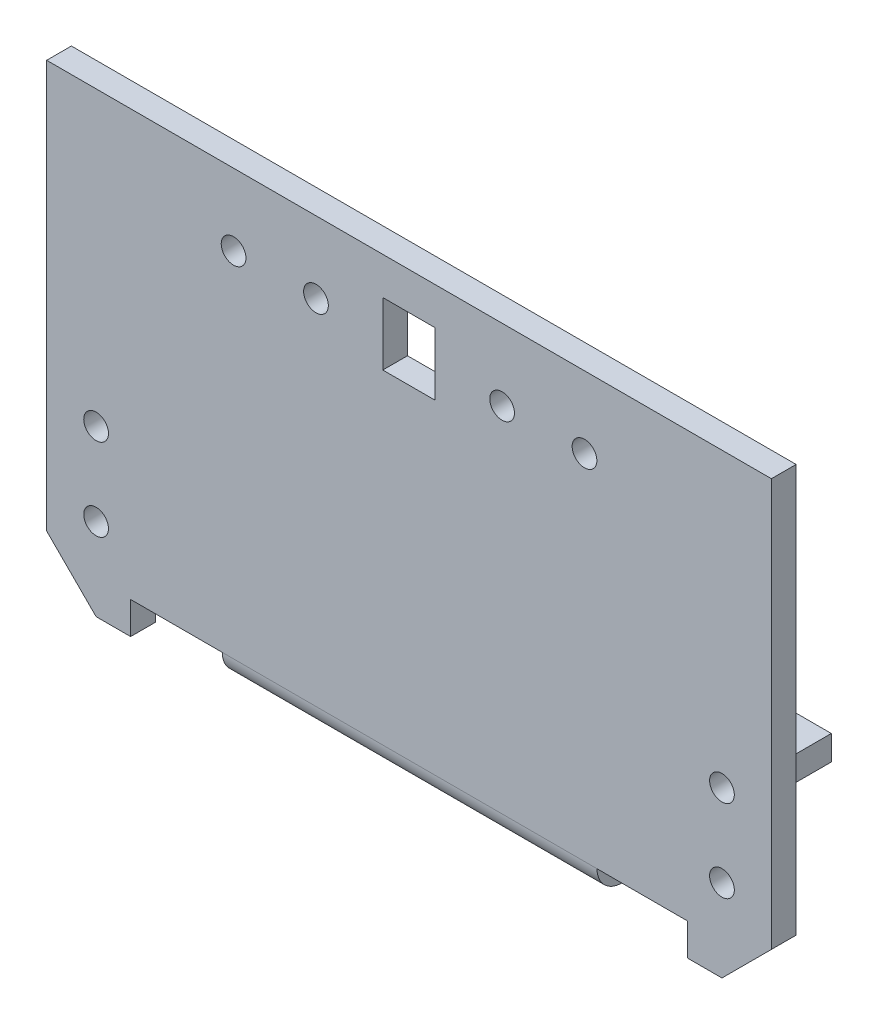
ISO-10303-21;
HEADER;
FILE_DESCRIPTION(('STEP AP214'),'2;1');
FILE_NAME('part.step','',(''),(''),'','','');
FILE_SCHEMA(('AUTOMOTIVE_DESIGN { 1 0 10303 214 1 1 1 1 }'));
ENDSEC;
DATA;
#1=APPLICATION_CONTEXT('core data for automotive mechanical design processes');
#2=APPLICATION_PROTOCOL_DEFINITION('international standard','automotive_design',2000,#1);
#3=PRODUCT_CONTEXT('',#1,'mechanical');
#4=PRODUCT('Part','Part','',(#3));
#5=PRODUCT_RELATED_PRODUCT_CATEGORY('part','',(#4));
#6=PRODUCT_DEFINITION_FORMATION('','',#4);
#7=PRODUCT_DEFINITION_CONTEXT('part definition',#1,'design');
#8=PRODUCT_DEFINITION('design','',#6,#7);
#9=PRODUCT_DEFINITION_SHAPE('','',#8);
#10=(LENGTH_UNIT() NAMED_UNIT(*) SI_UNIT(.MILLI.,.METRE.));
#11=(NAMED_UNIT(*) PLANE_ANGLE_UNIT() SI_UNIT($,.RADIAN.));
#12=(NAMED_UNIT(*) SI_UNIT($,.STERADIAN.) SOLID_ANGLE_UNIT());
#13=UNCERTAINTY_MEASURE_WITH_UNIT(LENGTH_MEASURE(1.E-05),#10,'distance_accuracy_value','');
#14=(GEOMETRIC_REPRESENTATION_CONTEXT(3) GLOBAL_UNCERTAINTY_ASSIGNED_CONTEXT((#13)) GLOBAL_UNIT_ASSIGNED_CONTEXT((#10,
#11,#12)) REPRESENTATION_CONTEXT('',''));
#15=CARTESIAN_POINT('',(0.,0.,0.));
#16=DIRECTION('',(0.,0.,1.));
#17=DIRECTION('',(1.,0.,0.));
#18=AXIS2_PLACEMENT_3D('',#15,#16,#17);
#19=CARTESIAN_POINT('',(33.7878643475448,18.60245734683,3.));
#20=DIRECTION('',(0.,-1.,0.));
#21=DIRECTION('',(1.,0.,0.));
#22=AXIS2_PLACEMENT_3D('',#19,#20,#21);
#23=PLANE('',#22);
#24=DIRECTION('',(-1.,0.,0.));
#25=VECTOR('',#24,1.);
#26=CARTESIAN_POINT('',(33.7878643475448,18.60245734683,0.));
#27=LINE('',#26,#25);
#28=CARTESIAN_POINT('',(-22.6647167125975,18.60245734683,0.));
#29=VERTEX_POINT('',#28);
#30=CARTESIAN_POINT('',(-33.7878643475448,18.60245734683,0.));
#31=VERTEX_POINT('',#30);
#32=EDGE_CURVE('E447',#29,#31,#27,.T.);
#33=ORIENTED_EDGE('',*,*,#32,.F.);
#34=DIRECTION('',(0.,0.,-1.));
#35=VECTOR('',#34,1.);
#36=CARTESIAN_POINT('',(-22.6647167125975,18.60245734683,0.));
#37=LINE('',#36,#35);
#38=CARTESIAN_POINT('',(-22.6647167125975,18.60245734683,3.));
#39=VERTEX_POINT('',#38);
#40=EDGE_CURVE('E234',#39,#29,#37,.T.);
#41=ORIENTED_EDGE('',*,*,#40,.F.);
#42=DIRECTION('',(-1.,0.,0.));
#43=VECTOR('',#42,1.);
#44=CARTESIAN_POINT('',(33.7878643475448,18.60245734683,3.));
#45=LINE('',#44,#43);
#46=CARTESIAN_POINT('',(-33.7878643475448,18.60245734683,3.));
#47=VERTEX_POINT('',#46);
#48=EDGE_CURVE('E411',#39,#47,#45,.T.);
#49=ORIENTED_EDGE('',*,*,#48,.T.);
#50=DIRECTION('',(0.,0.,-1.));
#51=VECTOR('',#50,1.);
#52=CARTESIAN_POINT('',(-33.7878643475448,18.60245734683,3.));
#53=LINE('',#52,#51);
#54=EDGE_CURVE('E482',#47,#31,#53,.T.);
#55=ORIENTED_EDGE('',*,*,#54,.T.);
#56=EDGE_LOOP('',(#33,#41,#49,#55));
#57=FACE_BOUND('',#56,.T.);
#58=ADVANCED_FACE('F47',(#57),#23,.T.);
#59=CARTESIAN_POINT('',(-43.9759450395278,70.1751243029359,3.));
#60=DIRECTION('',(0.,1.,0.));
#61=DIRECTION('',(0.,0.,1.));
#62=AXIS2_PLACEMENT_3D('',#59,#60,#61);
#63=PLANE('',#62);
#64=DIRECTION('',(1.,0.,0.));
#65=VECTOR('',#64,1.);
#66=CARTESIAN_POINT('',(-43.9759450395278,70.1751243029359,0.));
#67=LINE('',#66,#65);
#68=CARTESIAN_POINT('',(-43.9759450395278,70.1751243029359,0.));
#69=VERTEX_POINT('',#68);
#70=CARTESIAN_POINT('',(43.9759450395278,70.1751243029359,0.));
#71=VERTEX_POINT('',#70);
#72=EDGE_CURVE('E392',#69,#71,#67,.T.);
#73=ORIENTED_EDGE('',*,*,#72,.F.);
#74=DIRECTION('',(0.,0.,-1.));
#75=VECTOR('',#74,1.);
#76=CARTESIAN_POINT('',(-43.9759450395278,70.1751243029359,3.));
#77=LINE('',#76,#75);
#78=CARTESIAN_POINT('',(-43.9759450395278,70.1751243029359,3.));
#79=VERTEX_POINT('',#78);
#80=EDGE_CURVE('E468',#79,#69,#77,.T.);
#81=ORIENTED_EDGE('',*,*,#80,.F.);
#82=DIRECTION('',(1.,0.,0.));
#83=VECTOR('',#82,1.);
#84=CARTESIAN_POINT('',(-43.9759450395278,70.1751243029359,3.));
#85=LINE('',#84,#83);
#86=CARTESIAN_POINT('',(43.9759450395278,70.1751243029359,3.));
#87=VERTEX_POINT('',#86);
#88=EDGE_CURVE('E393',#79,#87,#85,.T.);
#89=ORIENTED_EDGE('',*,*,#88,.T.);
#90=DIRECTION('',(0.,0.,-1.));
#91=VECTOR('',#90,1.);
#92=CARTESIAN_POINT('',(43.9759450395278,70.1751243029359,3.));
#93=LINE('',#92,#91);
#94=EDGE_CURVE('E431',#87,#71,#93,.T.);
#95=ORIENTED_EDGE('',*,*,#94,.T.);
#96=EDGE_LOOP('',(#73,#81,#89,#95));
#97=FACE_BOUND('',#96,.T.);
#98=ADVANCED_FACE('F568',(#97),#63,.T.);
#99=CARTESIAN_POINT('',(-43.9759450395278,28.4551243029359,3.));
#100=DIRECTION('',(-1.,0.,0.));
#101=DIRECTION('',(0.,0.,1.));
#102=AXIS2_PLACEMENT_3D('',#99,#100,#101);
#103=PLANE('',#102);
#104=DIRECTION('',(0.,1.,0.));
#105=VECTOR('',#104,1.);
#106=CARTESIAN_POINT('',(-43.9759450395278,28.4551243029359,0.));
#107=LINE('',#106,#105);
#108=CARTESIAN_POINT('',(-43.9759450395278,20.6992622489842,0.));
#109=VERTEX_POINT('',#108);
#110=EDGE_CURVE('E398',#109,#69,#107,.T.);
#111=ORIENTED_EDGE('',*,*,#110,.F.);
#112=DIRECTION('',(0.,0.,-1.));
#113=VECTOR('',#112,1.);
#114=CARTESIAN_POINT('',(-43.9759450395278,20.6992622489842,3.));
#115=LINE('',#114,#113);
#116=CARTESIAN_POINT('',(-43.9759450395278,20.6992622489842,3.));
#117=VERTEX_POINT('',#116);
#118=EDGE_CURVE('E472',#117,#109,#115,.T.);
#119=ORIENTED_EDGE('',*,*,#118,.F.);
#120=DIRECTION('',(0.,1.,0.));
#121=VECTOR('',#120,1.);
#122=CARTESIAN_POINT('',(-43.9759450395278,20.6992622489842,3.));
#123=LINE('',#122,#121);
#124=EDGE_CURVE('E428',#117,#79,#123,.T.);
#125=ORIENTED_EDGE('',*,*,#124,.T.);
#126=ORIENTED_EDGE('',*,*,#80,.T.);
#127=EDGE_LOOP('',(#111,#119,#125,#126));
#128=FACE_BOUND('',#127,.T.);
#129=ADVANCED_FACE('F562',(#128),#103,.T.);
#130=CARTESIAN_POINT('',(-37.9759450395278,14.6992622489842,3.));
#131=DIRECTION('',(-0.707106781186548,-0.707106781186548,0.));
#132=DIRECTION('',(0.707106781186548,-0.707106781186548,0.));
#133=AXIS2_PLACEMENT_3D('',#130,#131,#132);
#134=PLANE('',#133);
#135=DIRECTION('',(-0.707106781186547,0.707106781186547,0.));
#136=VECTOR('',#135,1.);
#137=CARTESIAN_POINT('',(-37.9759450395278,14.6992622489842,0.));
#138=LINE('',#137,#136);
#139=CARTESIAN_POINT('',(-37.9759450395278,14.6992622489842,0.));
#140=VERTEX_POINT('',#139);
#141=EDGE_CURVE('E461',#140,#109,#138,.T.);
#142=ORIENTED_EDGE('',*,*,#141,.F.);
#143=DIRECTION('',(0.,0.,-1.));
#144=VECTOR('',#143,1.);
#145=CARTESIAN_POINT('',(-37.9759450395278,14.6992622489842,3.));
#146=LINE('',#145,#144);
#147=CARTESIAN_POINT('',(-37.9759450395278,14.6992622489842,3.));
#148=VERTEX_POINT('',#147);
#149=EDGE_CURVE('E476',#148,#140,#146,.T.);
#150=ORIENTED_EDGE('',*,*,#149,.F.);
#151=DIRECTION('',(-0.707106781186547,0.707106781186547,0.));
#152=VECTOR('',#151,1.);
#153=CARTESIAN_POINT('',(-37.9759450395278,14.6992622489842,3.));
#154=LINE('',#153,#152);
#155=EDGE_CURVE('E424',#148,#117,#154,.T.);
#156=ORIENTED_EDGE('',*,*,#155,.T.);
#157=ORIENTED_EDGE('',*,*,#118,.T.);
#158=EDGE_LOOP('',(#142,#150,#156,#157));
#159=FACE_BOUND('',#158,.T.);
#160=ADVANCED_FACE('F558',(#159),#134,.T.);
#161=CARTESIAN_POINT('',(-33.7878643475448,14.6992622489842,3.));
#162=DIRECTION('',(0.,-1.,0.));
#163=DIRECTION('',(0.,0.,-1.));
#164=AXIS2_PLACEMENT_3D('',#161,#162,#163);
#165=PLANE('',#164);
#166=DIRECTION('',(-1.,0.,0.));
#167=VECTOR('',#166,1.);
#168=CARTESIAN_POINT('',(-33.7878643475448,14.6992622489842,0.));
#169=LINE('',#168,#167);
#170=CARTESIAN_POINT('',(-33.7878643475448,14.6992622489842,0.));
#171=VERTEX_POINT('',#170);
#172=EDGE_CURVE('E457',#171,#140,#169,.T.);
#173=ORIENTED_EDGE('',*,*,#172,.F.);
#174=DIRECTION('',(0.,0.,-1.));
#175=VECTOR('',#174,1.);
#176=CARTESIAN_POINT('',(-33.7878643475448,14.6992622489842,3.));
#177=LINE('',#176,#175);
#178=CARTESIAN_POINT('',(-33.7878643475448,14.6992622489842,3.));
#179=VERTEX_POINT('',#178);
#180=EDGE_CURVE('E479',#179,#171,#177,.T.);
#181=ORIENTED_EDGE('',*,*,#180,.F.);
#182=DIRECTION('',(-1.,0.,0.));
#183=VECTOR('',#182,1.);
#184=CARTESIAN_POINT('',(-33.7878643475448,14.6992622489842,3.));
#185=LINE('',#184,#183);
#186=EDGE_CURVE('E420',#179,#148,#185,.T.);
#187=ORIENTED_EDGE('',*,*,#186,.T.);
#188=ORIENTED_EDGE('',*,*,#149,.T.);
#189=EDGE_LOOP('',(#173,#181,#187,#188));
#190=FACE_BOUND('',#189,.T.);
#191=ADVANCED_FACE('F555',(#190),#165,.T.);
#192=CARTESIAN_POINT('',(-33.7878643475448,18.60245734683,3.));
#193=DIRECTION('',(1.,0.,0.));
#194=DIRECTION('',(0.,0.,-1.));
#195=AXIS2_PLACEMENT_3D('',#192,#193,#194);
#196=PLANE('',#195);
#197=DIRECTION('',(0.,-1.,0.));
#198=VECTOR('',#197,1.);
#199=CARTESIAN_POINT('',(-33.7878643475448,18.60245734683,0.));
#200=LINE('',#199,#198);
#201=EDGE_CURVE('E452',#31,#171,#200,.T.);
#202=ORIENTED_EDGE('',*,*,#201,.F.);
#203=ORIENTED_EDGE('',*,*,#54,.F.);
#204=DIRECTION('',(0.,-1.,0.));
#205=VECTOR('',#204,1.);
#206=CARTESIAN_POINT('',(-33.7878643475448,18.60245734683,3.));
#207=LINE('',#206,#205);
#208=EDGE_CURVE('E416',#47,#179,#207,.T.);
#209=ORIENTED_EDGE('',*,*,#208,.T.);
#210=ORIENTED_EDGE('',*,*,#180,.T.);
#211=EDGE_LOOP('',(#202,#203,#209,#210));
#212=FACE_BOUND('',#211,.T.);
#213=ADVANCED_FACE('F551',(#212),#196,.T.);
#214=DIRECTION('',(0.,0.,-1.));
#215=VECTOR('',#214,1.);
#216=CARTESIAN_POINT('',(22.8152832874025,18.60245734683,0.));
#217=LINE('',#216,#215);
#218=CARTESIAN_POINT('',(22.8152832874025,18.60245734683,3.));
#219=VERTEX_POINT('',#218);
#220=CARTESIAN_POINT('',(22.8152832874025,18.60245734683,0.));
#221=VERTEX_POINT('',#220);
#222=EDGE_CURVE('E265',#219,#221,#217,.T.);
#223=ORIENTED_EDGE('',*,*,#222,.T.);
#224=CARTESIAN_POINT('',(33.7878643475448,18.60245734683,0.));
#225=VERTEX_POINT('',#224);
#226=EDGE_CURVE('E448',#225,#221,#27,.T.);
#227=ORIENTED_EDGE('',*,*,#226,.F.);
#228=DIRECTION('',(0.,0.,-1.));
#229=VECTOR('',#228,1.);
#230=CARTESIAN_POINT('',(33.7878643475448,18.60245734683,3.));
#231=LINE('',#230,#229);
#232=CARTESIAN_POINT('',(33.7878643475448,18.60245734683,3.));
#233=VERTEX_POINT('',#232);
#234=EDGE_CURVE('E486',#233,#225,#231,.T.);
#235=ORIENTED_EDGE('',*,*,#234,.F.);
#236=EDGE_CURVE('E412',#233,#219,#45,.T.);
#237=ORIENTED_EDGE('',*,*,#236,.T.);
#238=EDGE_LOOP('',(#223,#227,#235,#237));
#239=FACE_BOUND('',#238,.T.);
#240=ADVANCED_FACE('F517',(#239),#23,.T.);
#241=CARTESIAN_POINT('',(33.7878643475448,18.60245734683,3.));
#242=DIRECTION('',(1.,0.,0.));
#243=DIRECTION('',(0.,0.,-1.));
#244=AXIS2_PLACEMENT_3D('',#241,#242,#243);
#245=PLANE('',#244);
#246=DIRECTION('',(0.,-1.,0.));
#247=VECTOR('',#246,1.);
#248=CARTESIAN_POINT('',(33.7878643475448,18.60245734683,0.));
#249=LINE('',#248,#247);
#250=CARTESIAN_POINT('',(33.7878643475448,14.6992622489842,0.));
#251=VERTEX_POINT('',#250);
#252=EDGE_CURVE('E444',#225,#251,#249,.T.);
#253=ORIENTED_EDGE('',*,*,#252,.T.);
#254=DIRECTION('',(0.,0.,-1.));
#255=VECTOR('',#254,1.);
#256=CARTESIAN_POINT('',(33.7878643475448,14.6992622489842,3.));
#257=LINE('',#256,#255);
#258=CARTESIAN_POINT('',(33.7878643475448,14.6992622489842,3.));
#259=VERTEX_POINT('',#258);
#260=EDGE_CURVE('E489',#259,#251,#257,.T.);
#261=ORIENTED_EDGE('',*,*,#260,.F.);
#262=DIRECTION('',(0.,-1.,0.));
#263=VECTOR('',#262,1.);
#264=CARTESIAN_POINT('',(33.7878643475448,18.60245734683,3.));
#265=LINE('',#264,#263);
#266=EDGE_CURVE('E408',#233,#259,#265,.T.);
#267=ORIENTED_EDGE('',*,*,#266,.F.);
#268=ORIENTED_EDGE('',*,*,#234,.T.);
#269=EDGE_LOOP('',(#253,#261,#267,#268));
#270=FACE_BOUND('',#269,.T.);
#271=ADVANCED_FACE('F585',(#270),#245,.F.);
#272=CARTESIAN_POINT('',(33.7878643475448,14.6992622489842,3.));
#273=DIRECTION('',(0.,1.,0.));
#274=DIRECTION('',(0.,0.,1.));
#275=AXIS2_PLACEMENT_3D('',#272,#273,#274);
#276=PLANE('',#275);
#277=DIRECTION('',(1.,0.,0.));
#278=VECTOR('',#277,1.);
#279=CARTESIAN_POINT('',(33.7878643475448,14.6992622489842,0.));
#280=LINE('',#279,#278);
#281=CARTESIAN_POINT('',(37.9759450395278,14.6992622489842,0.));
#282=VERTEX_POINT('',#281);
#283=EDGE_CURVE('E441',#251,#282,#280,.T.);
#284=ORIENTED_EDGE('',*,*,#283,.T.);
#285=DIRECTION('',(0.,0.,-1.));
#286=VECTOR('',#285,1.);
#287=CARTESIAN_POINT('',(37.9759450395278,14.6992622489842,3.));
#288=LINE('',#287,#286);
#289=CARTESIAN_POINT('',(37.9759450395278,14.6992622489842,3.));
#290=VERTEX_POINT('',#289);
#291=EDGE_CURVE('E493',#290,#282,#288,.T.);
#292=ORIENTED_EDGE('',*,*,#291,.F.);
#293=DIRECTION('',(1.,0.,0.));
#294=VECTOR('',#293,1.);
#295=CARTESIAN_POINT('',(33.7878643475448,14.6992622489842,3.));
#296=LINE('',#295,#294);
#297=EDGE_CURVE('E405',#259,#290,#296,.T.);
#298=ORIENTED_EDGE('',*,*,#297,.F.);
#299=ORIENTED_EDGE('',*,*,#260,.T.);
#300=EDGE_LOOP('',(#284,#292,#298,#299));
#301=FACE_BOUND('',#300,.T.);
#302=ADVANCED_FACE('F581',(#301),#276,.F.);
#303=CARTESIAN_POINT('',(37.9759450395278,14.6992622489842,3.));
#304=DIRECTION('',(-0.707106781186548,0.707106781186548,0.));
#305=DIRECTION('',(-0.707106781186548,-0.707106781186548,0.));
#306=AXIS2_PLACEMENT_3D('',#303,#304,#305);
#307=PLANE('',#306);
#308=DIRECTION('',(0.707106781186547,0.707106781186547,0.));
#309=VECTOR('',#308,1.);
#310=CARTESIAN_POINT('',(37.9759450395278,14.6992622489842,0.));
#311=LINE('',#310,#309);
#312=CARTESIAN_POINT('',(43.9759450395278,20.6992622489842,0.));
#313=VERTEX_POINT('',#312);
#314=EDGE_CURVE('E438',#282,#313,#311,.T.);
#315=ORIENTED_EDGE('',*,*,#314,.T.);
#316=DIRECTION('',(0.,0.,-1.));
#317=VECTOR('',#316,1.);
#318=CARTESIAN_POINT('',(43.9759450395278,20.6992622489842,3.));
#319=LINE('',#318,#317);
#320=CARTESIAN_POINT('',(43.9759450395278,20.6992622489842,3.));
#321=VERTEX_POINT('',#320);
#322=EDGE_CURVE('E497',#321,#313,#319,.T.);
#323=ORIENTED_EDGE('',*,*,#322,.F.);
#324=DIRECTION('',(0.707106781186547,0.707106781186547,0.));
#325=VECTOR('',#324,1.);
#326=CARTESIAN_POINT('',(37.9759450395278,14.6992622489842,3.));
#327=LINE('',#326,#325);
#328=EDGE_CURVE('E401',#290,#321,#327,.T.);
#329=ORIENTED_EDGE('',*,*,#328,.F.);
#330=ORIENTED_EDGE('',*,*,#291,.T.);
#331=EDGE_LOOP('',(#315,#323,#329,#330));
#332=FACE_BOUND('',#331,.T.);
#333=ADVANCED_FACE('F577',(#332),#307,.F.);
#334=CARTESIAN_POINT('',(43.9759450395278,20.6992622489842,3.));
#335=DIRECTION('',(-1.,0.,0.));
#336=DIRECTION('',(0.,0.,1.));
#337=AXIS2_PLACEMENT_3D('',#334,#335,#336);
#338=PLANE('',#337);
#339=DIRECTION('',(0.,1.,0.));
#340=VECTOR('',#339,1.);
#341=CARTESIAN_POINT('',(43.9759450395278,20.6992622489842,0.));
#342=LINE('',#341,#340);
#343=EDGE_CURVE('E435',#313,#71,#342,.T.);
#344=ORIENTED_EDGE('',*,*,#343,.T.);
#345=ORIENTED_EDGE('',*,*,#94,.F.);
#346=DIRECTION('',(0.,-1.,0.));
#347=VECTOR('',#346,1.);
#348=CARTESIAN_POINT('',(43.9759450395278,70.1751243029359,3.));
#349=LINE('',#348,#347);
#350=EDGE_CURVE('E397',#87,#321,#349,.T.);
#351=ORIENTED_EDGE('',*,*,#350,.T.);
#352=ORIENTED_EDGE('',*,*,#322,.T.);
#353=EDGE_LOOP('',(#344,#345,#351,#352));
#354=FACE_BOUND('',#353,.T.);
#355=ADVANCED_FACE('F573',(#354),#338,.F.);
#356=CARTESIAN_POINT('',(0.,0.,3.));
#357=DIRECTION('',(0.,0.,-1.));
#358=DIRECTION('',(-1.,0.,0.));
#359=AXIS2_PLACEMENT_3D('',#356,#357,#358);
#360=PLANE('',#359);
#361=DIRECTION('',(1.,0.,0.));
#362=VECTOR('',#361,1.);
#363=CARTESIAN_POINT('',(3.16627005048455,58.0165066639533,3.));
#364=LINE('',#363,#362);
#365=CARTESIAN_POINT('',(-3.18372994950953,58.0165066639533,3.));
#366=VERTEX_POINT('',#365);
#367=CARTESIAN_POINT('',(3.16627005048455,58.0165066639533,3.));
#368=VERTEX_POINT('',#367);
#369=EDGE_CURVE('E292',#366,#368,#364,.T.);
#370=ORIENTED_EDGE('',*,*,#369,.F.);
#371=DIRECTION('',(0.,-1.,0.));
#372=VECTOR('',#371,1.);
#373=CARTESIAN_POINT('',(-3.18372994950953,58.0165066639533,3.));
#374=LINE('',#373,#372);
#375=CARTESIAN_POINT('',(-3.18372994950953,65.6365066645666,3.));
#376=VERTEX_POINT('',#375);
#377=EDGE_CURVE('E296',#376,#366,#374,.T.);
#378=ORIENTED_EDGE('',*,*,#377,.F.);
#379=DIRECTION('',(-1.,0.,0.));
#380=VECTOR('',#379,1.);
#381=CARTESIAN_POINT('',(-3.18372994950953,65.6365066645666,3.));
#382=LINE('',#381,#380);
#383=CARTESIAN_POINT('',(3.16627005048455,65.6365066645666,3.));
#384=VERTEX_POINT('',#383);
#385=EDGE_CURVE('E299',#384,#376,#382,.T.);
#386=ORIENTED_EDGE('',*,*,#385,.F.);
#387=DIRECTION('',(0.,1.,0.));
#388=VECTOR('',#387,1.);
#389=CARTESIAN_POINT('',(3.16627005048455,65.6365066645666,3.));
#390=LINE('',#389,#388);
#391=EDGE_CURVE('E288',#368,#384,#390,.T.);
#392=ORIENTED_EDGE('',*,*,#391,.F.);
#393=EDGE_LOOP('',(#370,#378,#386,#392));
#394=FACE_BOUND('',#393,.T.);
#395=CARTESIAN_POINT('',(21.2937812623763,61.4781525054685,3.));
#396=DIRECTION('',(0.,0.,1.));
#397=DIRECTION('',(1.,0.,0.));
#398=AXIS2_PLACEMENT_3D('',#395,#396,#397);
#399=CIRCLE('',#398,1.5);
#400=CARTESIAN_POINT('',(22.7937812623763,61.4781525054685,3.));
#401=VERTEX_POINT('',#400);
#402=EDGE_CURVE('E358',#401,#401,#399,.T.);
#403=ORIENTED_EDGE('',*,*,#402,.F.);
#404=EDGE_LOOP('',(#403));
#405=FACE_BOUND('',#404,.T.);
#406=CARTESIAN_POINT('',(-37.9759450395278,34.6992622489842,3.));
#407=DIRECTION('',(0.,0.,1.));
#408=DIRECTION('',(-1.,0.,0.));
#409=AXIS2_PLACEMENT_3D('',#406,#407,#408);
#410=CIRCLE('',#409,1.5);
#411=CARTESIAN_POINT('',(-39.4759450395278,34.6992622489842,3.));
#412=VERTEX_POINT('',#411);
#413=EDGE_CURVE('E357',#412,#412,#410,.T.);
#414=ORIENTED_EDGE('',*,*,#413,.F.);
#415=EDGE_LOOP('',(#414));
#416=FACE_BOUND('',#415,.T.);
#417=CARTESIAN_POINT('',(-37.9759450395278,24.6992622489842,3.));
#418=DIRECTION('',(0.,0.,1.));
#419=DIRECTION('',(-1.,0.,0.));
#420=AXIS2_PLACEMENT_3D('',#417,#418,#419);
#421=CIRCLE('',#420,1.5);
#422=CARTESIAN_POINT('',(-39.4759450395278,24.6992622489842,3.));
#423=VERTEX_POINT('',#422);
#424=EDGE_CURVE('E374',#423,#423,#421,.T.);
#425=ORIENTED_EDGE('',*,*,#424,.F.);
#426=EDGE_LOOP('',(#425));
#427=FACE_BOUND('',#426,.T.);
#428=CARTESIAN_POINT('',(37.9759450395278,34.6992622489842,3.));
#429=DIRECTION('',(0.,0.,1.));
#430=DIRECTION('',(1.,0.,0.));
#431=AXIS2_PLACEMENT_3D('',#428,#429,#430);
#432=CIRCLE('',#431,1.5);
#433=CARTESIAN_POINT('',(39.4759450395278,34.6992622489842,3.));
#434=VERTEX_POINT('',#433);
#435=EDGE_CURVE('E373',#434,#434,#432,.T.);
#436=ORIENTED_EDGE('',*,*,#435,.F.);
#437=EDGE_LOOP('',(#436));
#438=FACE_BOUND('',#437,.T.);
#439=CARTESIAN_POINT('',(-11.2937812623763,61.4781525054685,3.));
#440=DIRECTION('',(0.,0.,1.));
#441=DIRECTION('',(-1.,0.,0.));
#442=AXIS2_PLACEMENT_3D('',#439,#440,#441);
#443=CIRCLE('',#442,1.5);
#444=CARTESIAN_POINT('',(-12.7937812623763,61.4781525054685,3.));
#445=VERTEX_POINT('',#444);
#446=EDGE_CURVE('E333',#445,#445,#443,.T.);
#447=ORIENTED_EDGE('',*,*,#446,.F.);
#448=EDGE_LOOP('',(#447));
#449=FACE_BOUND('',#448,.T.);
#450=CARTESIAN_POINT('',(11.2937812623763,61.4781525054685,3.));
#451=DIRECTION('',(0.,0.,1.));
#452=DIRECTION('',(1.,0.,0.));
#453=AXIS2_PLACEMENT_3D('',#450,#451,#452);
#454=CIRCLE('',#453,1.5);
#455=CARTESIAN_POINT('',(12.7937812623763,61.4781525054685,3.));
#456=VERTEX_POINT('',#455);
#457=EDGE_CURVE('E334',#456,#456,#454,.T.);
#458=ORIENTED_EDGE('',*,*,#457,.F.);
#459=EDGE_LOOP('',(#458));
#460=FACE_BOUND('',#459,.T.);
#461=CARTESIAN_POINT('',(-21.2937812623763,61.4781525054685,3.));
#462=DIRECTION('',(0.,0.,1.));
#463=DIRECTION('',(-1.,0.,0.));
#464=AXIS2_PLACEMENT_3D('',#461,#462,#463);
#465=CIRCLE('',#464,1.5);
#466=CARTESIAN_POINT('',(-22.7937812623763,61.4781525054685,3.));
#467=VERTEX_POINT('',#466);
#468=EDGE_CURVE('E343',#467,#467,#465,.T.);
#469=ORIENTED_EDGE('',*,*,#468,.F.);
#470=EDGE_LOOP('',(#469));
#471=FACE_BOUND('',#470,.T.);
#472=CARTESIAN_POINT('',(37.9759450395278,24.6992622489842,3.));
#473=DIRECTION('',(0.,0.,1.));
#474=DIRECTION('',(1.,0.,0.));
#475=AXIS2_PLACEMENT_3D('',#472,#473,#474);
#476=CIRCLE('',#475,1.5);
#477=CARTESIAN_POINT('',(39.4759450395278,24.6992622489842,3.));
#478=VERTEX_POINT('',#477);
#479=EDGE_CURVE('E378',#478,#478,#476,.T.);
#480=ORIENTED_EDGE('',*,*,#479,.F.);
#481=EDGE_LOOP('',(#480));
#482=FACE_BOUND('',#481,.T.);
#483=ORIENTED_EDGE('',*,*,#48,.F.);
#484=DIRECTION('',(-1.,0.,0.));
#485=VECTOR('',#484,1.);
#486=CARTESIAN_POINT('',(22.8152832874025,18.60245734683,3.));
#487=LINE('',#486,#485);
#488=EDGE_CURVE('E56',#39,#219,#487,.F.);
#489=ORIENTED_EDGE('',*,*,#488,.T.);
#490=ORIENTED_EDGE('',*,*,#236,.F.);
#491=ORIENTED_EDGE('',*,*,#266,.T.);
#492=ORIENTED_EDGE('',*,*,#297,.T.);
#493=ORIENTED_EDGE('',*,*,#328,.T.);
#494=ORIENTED_EDGE('',*,*,#350,.F.);
#495=ORIENTED_EDGE('',*,*,#88,.F.);
#496=ORIENTED_EDGE('',*,*,#124,.F.);
#497=ORIENTED_EDGE('',*,*,#155,.F.);
#498=ORIENTED_EDGE('',*,*,#186,.F.);
#499=ORIENTED_EDGE('',*,*,#208,.F.);
#500=EDGE_LOOP('',(#483,#489,#490,#491,#492,#493,#494,#495,#496,#497,#498,#499));
#501=FACE_BOUND('',#500,.T.);
#502=ADVANCED_FACE('F511',(#394,#405,#416,#427,#438,#449,#460,#471,#482,#501),#360,.F.);
#503=CARTESIAN_POINT('',(0.,0.,0.));
#504=DIRECTION('',(0.,0.,-1.));
#505=DIRECTION('',(-1.,0.,0.));
#506=AXIS2_PLACEMENT_3D('',#503,#504,#505);
#507=PLANE('',#506);
#508=DIRECTION('',(0.,1.,0.));
#509=VECTOR('',#508,1.);
#510=CARTESIAN_POINT('',(-3.18372994950953,58.0165066639533,0.));
#511=LINE('',#510,#509);
#512=CARTESIAN_POINT('',(-3.18372994950953,58.0165066639533,0.));
#513=VERTEX_POINT('',#512);
#514=CARTESIAN_POINT('',(-3.18372994950953,65.6365066645666,0.));
#515=VERTEX_POINT('',#514);
#516=EDGE_CURVE('E214',#513,#515,#511,.T.);
#517=ORIENTED_EDGE('',*,*,#516,.F.);
#518=DIRECTION('',(-1.,0.,0.));
#519=VECTOR('',#518,1.);
#520=CARTESIAN_POINT('',(3.16627005048455,58.0165066639533,0.));
#521=LINE('',#520,#519);
#522=CARTESIAN_POINT('',(3.16627005048455,58.0165066639533,0.));
#523=VERTEX_POINT('',#522);
#524=EDGE_CURVE('E310',#523,#513,#521,.T.);
#525=ORIENTED_EDGE('',*,*,#524,.F.);
#526=DIRECTION('',(0.,-1.,0.));
#527=VECTOR('',#526,1.);
#528=CARTESIAN_POINT('',(3.16627005048455,65.6365066645666,0.));
#529=LINE('',#528,#527);
#530=CARTESIAN_POINT('',(3.16627005048455,65.6365066645666,0.));
#531=VERTEX_POINT('',#530);
#532=EDGE_CURVE('E306',#531,#523,#529,.T.);
#533=ORIENTED_EDGE('',*,*,#532,.F.);
#534=DIRECTION('',(1.,0.,0.));
#535=VECTOR('',#534,1.);
#536=CARTESIAN_POINT('',(-3.18372994950953,65.6365066645666,0.));
#537=LINE('',#536,#535);
#538=EDGE_CURVE('E302',#515,#531,#537,.T.);
#539=ORIENTED_EDGE('',*,*,#538,.F.);
#540=EDGE_LOOP('',(#517,#525,#533,#539));
#541=FACE_BOUND('',#540,.T.);
#542=CARTESIAN_POINT('',(21.2937812623763,61.4781525054685,0.));
#543=DIRECTION('',(0.,0.,-1.));
#544=DIRECTION('',(-1.,0.,0.));
#545=AXIS2_PLACEMENT_3D('',#542,#543,#544);
#546=CIRCLE('',#545,1.5);
#547=CARTESIAN_POINT('',(19.7937812623763,61.4781525054685,0.));
#548=VERTEX_POINT('',#547);
#549=EDGE_CURVE('E338',#548,#548,#546,.F.);
#550=ORIENTED_EDGE('',*,*,#549,.T.);
#551=EDGE_LOOP('',(#550));
#552=FACE_BOUND('',#551,.T.);
#553=CARTESIAN_POINT('',(-37.9759450395278,34.6992622489842,0.));
#554=DIRECTION('',(0.,0.,-1.));
#555=DIRECTION('',(-1.,0.,0.));
#556=AXIS2_PLACEMENT_3D('',#553,#554,#555);
#557=CIRCLE('',#556,1.5);
#558=CARTESIAN_POINT('',(-39.4759450395278,34.6992622489842,0.));
#559=VERTEX_POINT('',#558);
#560=EDGE_CURVE('E353',#559,#559,#557,.F.);
#561=ORIENTED_EDGE('',*,*,#560,.T.);
#562=EDGE_LOOP('',(#561));
#563=FACE_BOUND('',#562,.T.);
#564=CARTESIAN_POINT('',(-37.9759450395278,24.6992622489842,0.));
#565=DIRECTION('',(0.,0.,-1.));
#566=DIRECTION('',(-1.,0.,0.));
#567=AXIS2_PLACEMENT_3D('',#564,#565,#566);
#568=CIRCLE('',#567,1.5);
#569=CARTESIAN_POINT('',(-39.4759450395278,24.6992622489842,0.));
#570=VERTEX_POINT('',#569);
#571=EDGE_CURVE('E362',#570,#570,#568,.F.);
#572=ORIENTED_EDGE('',*,*,#571,.T.);
#573=EDGE_LOOP('',(#572));
#574=FACE_BOUND('',#573,.T.);
#575=CARTESIAN_POINT('',(37.9759450395278,34.6992622489842,0.));
#576=DIRECTION('',(0.,0.,-1.));
#577=DIRECTION('',(-1.,0.,0.));
#578=AXIS2_PLACEMENT_3D('',#575,#576,#577);
#579=CIRCLE('',#578,1.5);
#580=CARTESIAN_POINT('',(36.4759450395278,34.6992622489842,0.));
#581=VERTEX_POINT('',#580);
#582=EDGE_CURVE('E369',#581,#581,#579,.F.);
#583=ORIENTED_EDGE('',*,*,#582,.T.);
#584=EDGE_LOOP('',(#583));
#585=FACE_BOUND('',#584,.T.);
#586=CARTESIAN_POINT('',(-11.2937812623763,61.4781525054685,0.));
#587=DIRECTION('',(0.,0.,-1.));
#588=DIRECTION('',(-1.,0.,0.));
#589=AXIS2_PLACEMENT_3D('',#586,#587,#588);
#590=CIRCLE('',#589,1.5);
#591=CARTESIAN_POINT('',(-12.7937812623763,61.4781525054685,0.));
#592=VERTEX_POINT('',#591);
#593=EDGE_CURVE('E329',#592,#592,#590,.F.);
#594=ORIENTED_EDGE('',*,*,#593,.T.);
#595=EDGE_LOOP('',(#594));
#596=FACE_BOUND('',#595,.T.);
#597=CARTESIAN_POINT('',(11.2937812623763,61.4781525054685,0.));
#598=DIRECTION('',(0.,0.,-1.));
#599=DIRECTION('',(-1.,0.,0.));
#600=AXIS2_PLACEMENT_3D('',#597,#598,#599);
#601=CIRCLE('',#600,1.5);
#602=CARTESIAN_POINT('',(9.79378126237625,61.4781525054685,0.));
#603=VERTEX_POINT('',#602);
#604=EDGE_CURVE('E339',#603,#603,#601,.F.);
#605=ORIENTED_EDGE('',*,*,#604,.T.);
#606=EDGE_LOOP('',(#605));
#607=FACE_BOUND('',#606,.T.);
#608=CARTESIAN_POINT('',(-21.2937812623763,61.4781525054685,0.));
#609=DIRECTION('',(0.,0.,-1.));
#610=DIRECTION('',(-1.,0.,0.));
#611=AXIS2_PLACEMENT_3D('',#608,#609,#610);
#612=CIRCLE('',#611,1.5);
#613=CARTESIAN_POINT('',(-22.7937812623763,61.4781525054685,0.));
#614=VERTEX_POINT('',#613);
#615=EDGE_CURVE('E328',#614,#614,#612,.F.);
#616=ORIENTED_EDGE('',*,*,#615,.T.);
#617=EDGE_LOOP('',(#616));
#618=FACE_BOUND('',#617,.T.);
#619=CARTESIAN_POINT('',(37.9759450395278,24.6992622489842,0.));
#620=DIRECTION('',(0.,0.,-1.));
#621=DIRECTION('',(-1.,0.,0.));
#622=AXIS2_PLACEMENT_3D('',#619,#620,#621);
#623=CIRCLE('',#622,1.5);
#624=CARTESIAN_POINT('',(36.4759450395278,24.6992622489842,0.));
#625=VERTEX_POINT('',#624);
#626=EDGE_CURVE('E388',#625,#625,#623,.F.);
#627=ORIENTED_EDGE('',*,*,#626,.T.);
#628=EDGE_LOOP('',(#627));
#629=FACE_BOUND('',#628,.T.);
#630=ORIENTED_EDGE('',*,*,#72,.T.);
#631=ORIENTED_EDGE('',*,*,#343,.F.);
#632=ORIENTED_EDGE('',*,*,#314,.F.);
#633=ORIENTED_EDGE('',*,*,#283,.F.);
#634=ORIENTED_EDGE('',*,*,#252,.F.);
#635=ORIENTED_EDGE('',*,*,#226,.T.);
#636=EDGE_CURVE('E453',#221,#29,#27,.T.);
#637=ORIENTED_EDGE('',*,*,#636,.T.);
#638=ORIENTED_EDGE('',*,*,#32,.T.);
#639=ORIENTED_EDGE('',*,*,#201,.T.);
#640=ORIENTED_EDGE('',*,*,#172,.T.);
#641=ORIENTED_EDGE('',*,*,#141,.T.);
#642=ORIENTED_EDGE('',*,*,#110,.T.);
#643=EDGE_LOOP('',(#630,#631,#632,#633,#634,#635,#637,#638,#639,#640,#641,#642));
#644=FACE_BOUND('',#643,.T.);
#645=ADVANCED_FACE('F546',(#541,#552,#563,#574,#585,#596,#607,#618,#629,#644),#507,.T.);
#646=CARTESIAN_POINT('',(37.9759450395278,24.6992622489842,-4.24264068711929));
#647=DIRECTION('',(0.,0.,1.));
#648=DIRECTION('',(1.,0.,0.));
#649=AXIS2_PLACEMENT_3D('',#646,#647,#648);
#650=CYLINDRICAL_SURFACE('',#649,1.5);
#651=ORIENTED_EDGE('',*,*,#479,.T.);
#652=EDGE_LOOP('',(#651));
#653=FACE_BOUND('',#652,.T.);
#654=ORIENTED_EDGE('',*,*,#626,.F.);
#655=EDGE_LOOP('',(#654));
#656=FACE_BOUND('',#655,.T.);
#657=ADVANCED_FACE('F610',(#653,#656),#650,.F.);
#658=CARTESIAN_POINT('',(-21.2937812623763,61.4781525054685,-4.24264068711929));
#659=DIRECTION('',(0.,0.,1.));
#660=DIRECTION('',(1.,0.,0.));
#661=AXIS2_PLACEMENT_3D('',#658,#659,#660);
#662=CYLINDRICAL_SURFACE('',#661,1.5);
#663=ORIENTED_EDGE('',*,*,#468,.T.);
#664=EDGE_LOOP('',(#663));
#665=FACE_BOUND('',#664,.T.);
#666=ORIENTED_EDGE('',*,*,#615,.F.);
#667=EDGE_LOOP('',(#666));
#668=FACE_BOUND('',#667,.T.);
#669=ADVANCED_FACE('F617',(#665,#668),#662,.F.);
#670=CARTESIAN_POINT('',(11.2937812623763,61.4781525054685,-4.24264068711929));
#671=DIRECTION('',(0.,0.,1.));
#672=DIRECTION('',(1.,0.,0.));
#673=AXIS2_PLACEMENT_3D('',#670,#671,#672);
#674=CYLINDRICAL_SURFACE('',#673,1.5);
#675=ORIENTED_EDGE('',*,*,#457,.T.);
#676=EDGE_LOOP('',(#675));
#677=FACE_BOUND('',#676,.T.);
#678=ORIENTED_EDGE('',*,*,#604,.F.);
#679=EDGE_LOOP('',(#678));
#680=FACE_BOUND('',#679,.T.);
#681=ADVANCED_FACE('F639',(#677,#680),#674,.F.);
#682=CARTESIAN_POINT('',(-11.2937812623763,61.4781525054685,-4.24264068711929));
#683=DIRECTION('',(0.,0.,1.));
#684=DIRECTION('',(1.,0.,0.));
#685=AXIS2_PLACEMENT_3D('',#682,#683,#684);
#686=CYLINDRICAL_SURFACE('',#685,1.5);
#687=ORIENTED_EDGE('',*,*,#446,.T.);
#688=EDGE_LOOP('',(#687));
#689=FACE_BOUND('',#688,.T.);
#690=ORIENTED_EDGE('',*,*,#593,.F.);
#691=EDGE_LOOP('',(#690));
#692=FACE_BOUND('',#691,.T.);
#693=ADVANCED_FACE('F627',(#689,#692),#686,.F.);
#694=CARTESIAN_POINT('',(37.9759450395278,34.6992622489842,-4.24264068711929));
#695=DIRECTION('',(0.,0.,1.));
#696=DIRECTION('',(1.,0.,0.));
#697=AXIS2_PLACEMENT_3D('',#694,#695,#696);
#698=CYLINDRICAL_SURFACE('',#697,1.5);
#699=ORIENTED_EDGE('',*,*,#435,.T.);
#700=EDGE_LOOP('',(#699));
#701=FACE_BOUND('',#700,.T.);
#702=ORIENTED_EDGE('',*,*,#582,.F.);
#703=EDGE_LOOP('',(#702));
#704=FACE_BOUND('',#703,.T.);
#705=ADVANCED_FACE('F623',(#701,#704),#698,.F.);
#706=CARTESIAN_POINT('',(-37.9759450395278,24.6992622489842,-4.24264068711929));
#707=DIRECTION('',(0.,0.,1.));
#708=DIRECTION('',(1.,0.,0.));
#709=AXIS2_PLACEMENT_3D('',#706,#707,#708);
#710=CYLINDRICAL_SURFACE('',#709,1.5);
#711=ORIENTED_EDGE('',*,*,#424,.T.);
#712=EDGE_LOOP('',(#711));
#713=FACE_BOUND('',#712,.T.);
#714=ORIENTED_EDGE('',*,*,#571,.F.);
#715=EDGE_LOOP('',(#714));
#716=FACE_BOUND('',#715,.T.);
#717=ADVANCED_FACE('F619',(#713,#716),#710,.F.);
#718=CARTESIAN_POINT('',(-37.9759450395278,34.6992622489842,-4.24264068711929));
#719=DIRECTION('',(0.,0.,1.));
#720=DIRECTION('',(1.,0.,0.));
#721=AXIS2_PLACEMENT_3D('',#718,#719,#720);
#722=CYLINDRICAL_SURFACE('',#721,1.5);
#723=ORIENTED_EDGE('',*,*,#413,.T.);
#724=EDGE_LOOP('',(#723));
#725=FACE_BOUND('',#724,.T.);
#726=ORIENTED_EDGE('',*,*,#560,.F.);
#727=EDGE_LOOP('',(#726));
#728=FACE_BOUND('',#727,.T.);
#729=ADVANCED_FACE('F622',(#725,#728),#722,.F.);
#730=CARTESIAN_POINT('',(21.2937812623763,61.4781525054685,-4.24264068711929));
#731=DIRECTION('',(0.,0.,1.));
#732=DIRECTION('',(1.,0.,0.));
#733=AXIS2_PLACEMENT_3D('',#730,#731,#732);
#734=CYLINDRICAL_SURFACE('',#733,1.5);
#735=ORIENTED_EDGE('',*,*,#402,.T.);
#736=EDGE_LOOP('',(#735));
#737=FACE_BOUND('',#736,.T.);
#738=ORIENTED_EDGE('',*,*,#549,.F.);
#739=EDGE_LOOP('',(#738));
#740=FACE_BOUND('',#739,.T.);
#741=ADVANCED_FACE('F629',(#737,#740),#734,.F.);
#742=CARTESIAN_POINT('',(-3.18372994950953,58.0165066639533,12.9190170888688));
#743=DIRECTION('',(-1.,0.,0.));
#744=DIRECTION('',(0.,0.,1.));
#745=AXIS2_PLACEMENT_3D('',#742,#743,#744);
#746=PLANE('',#745);
#747=ORIENTED_EDGE('',*,*,#377,.T.);
#748=DIRECTION('',(0.,0.,-1.));
#749=VECTOR('',#748,1.);
#750=CARTESIAN_POINT('',(-3.18372994950953,58.0165066639533,12.9190170888688));
#751=LINE('',#750,#749);
#752=EDGE_CURVE('E293',#366,#513,#751,.T.);
#753=ORIENTED_EDGE('',*,*,#752,.T.);
#754=ORIENTED_EDGE('',*,*,#516,.T.);
#755=DIRECTION('',(0.,0.,-1.));
#756=VECTOR('',#755,1.);
#757=CARTESIAN_POINT('',(-3.18372994950953,65.6365066645666,12.9190170888688));
#758=LINE('',#757,#756);
#759=EDGE_CURVE('E314',#376,#515,#758,.T.);
#760=ORIENTED_EDGE('',*,*,#759,.F.);
#761=EDGE_LOOP('',(#747,#753,#754,#760));
#762=FACE_BOUND('',#761,.T.);
#763=ADVANCED_FACE('F632',(#762),#746,.F.);
#764=CARTESIAN_POINT('',(3.16627005048455,58.0165066639533,12.9190170888688));
#765=DIRECTION('',(0.,-1.,0.));
#766=DIRECTION('',(0.,0.,-1.));
#767=AXIS2_PLACEMENT_3D('',#764,#765,#766);
#768=PLANE('',#767);
#769=ORIENTED_EDGE('',*,*,#369,.T.);
#770=DIRECTION('',(0.,0.,-1.));
#771=VECTOR('',#770,1.);
#772=CARTESIAN_POINT('',(3.16627005048455,58.0165066639533,12.9190170888688));
#773=LINE('',#772,#771);
#774=EDGE_CURVE('E317',#368,#523,#773,.T.);
#775=ORIENTED_EDGE('',*,*,#774,.T.);
#776=ORIENTED_EDGE('',*,*,#524,.T.);
#777=ORIENTED_EDGE('',*,*,#752,.F.);
#778=EDGE_LOOP('',(#769,#775,#776,#777));
#779=FACE_BOUND('',#778,.T.);
#780=ADVANCED_FACE('F649',(#779),#768,.F.);
#781=CARTESIAN_POINT('',(3.16627005048455,65.6365066645666,12.9190170888688));
#782=DIRECTION('',(1.,0.,0.));
#783=DIRECTION('',(0.,1.,0.));
#784=AXIS2_PLACEMENT_3D('',#781,#782,#783);
#785=PLANE('',#784);
#786=ORIENTED_EDGE('',*,*,#391,.T.);
#787=DIRECTION('',(0.,0.,-1.));
#788=VECTOR('',#787,1.);
#789=CARTESIAN_POINT('',(3.16627005048455,65.6365066645666,12.9190170888688));
#790=LINE('',#789,#788);
#791=EDGE_CURVE('E320',#384,#531,#790,.T.);
#792=ORIENTED_EDGE('',*,*,#791,.T.);
#793=ORIENTED_EDGE('',*,*,#532,.T.);
#794=ORIENTED_EDGE('',*,*,#774,.F.);
#795=EDGE_LOOP('',(#786,#792,#793,#794));
#796=FACE_BOUND('',#795,.T.);
#797=ADVANCED_FACE('F654',(#796),#785,.F.);
#798=CARTESIAN_POINT('',(-3.18372994950953,65.6365066645666,12.9190170888688));
#799=DIRECTION('',(0.,1.,0.));
#800=DIRECTION('',(0.,0.,1.));
#801=AXIS2_PLACEMENT_3D('',#798,#799,#800);
#802=PLANE('',#801);
#803=ORIENTED_EDGE('',*,*,#385,.T.);
#804=ORIENTED_EDGE('',*,*,#759,.T.);
#805=ORIENTED_EDGE('',*,*,#538,.T.);
#806=ORIENTED_EDGE('',*,*,#791,.F.);
#807=EDGE_LOOP('',(#803,#804,#805,#806));
#808=FACE_BOUND('',#807,.T.);
#809=ADVANCED_FACE('F651',(#808),#802,.F.);
#810=CARTESIAN_POINT('',(-12.6850881639586,15.60245734683,0.));
#811=DIRECTION('',(1.,0.,0.));
#812=DIRECTION('',(0.,1.,0.));
#813=AXIS2_PLACEMENT_3D('',#810,#811,#812);
#814=PLANE('',#813);
#815=DIRECTION('',(0.,0.,-1.));
#816=VECTOR('',#815,1.);
#817=CARTESIAN_POINT('',(-12.6850881639586,18.60245734683,0.));
#818=LINE('',#817,#816);
#819=CARTESIAN_POINT('',(-12.6850881639586,18.60245734683,-20.4341208286026));
#820=VERTEX_POINT('',#819);
#821=CARTESIAN_POINT('',(-12.6850881639586,18.60245734683,-25.4341208286026));
#822=VERTEX_POINT('',#821);
#823=EDGE_CURVE('E210',#820,#822,#818,.T.);
#824=ORIENTED_EDGE('',*,*,#823,.F.);
#825=DIRECTION('',(0.,1.,0.));
#826=VECTOR('',#825,1.);
#827=CARTESIAN_POINT('',(-12.6850881639586,15.60245734683,-20.4341208286026));
#828=LINE('',#827,#826);
#829=CARTESIAN_POINT('',(-12.6850881639586,15.60245734683,-20.4341208286026));
#830=VERTEX_POINT('',#829);
#831=EDGE_CURVE('E203',#830,#820,#828,.T.);
#832=ORIENTED_EDGE('',*,*,#831,.F.);
#833=DIRECTION('',(0.,0.,-1.));
#834=VECTOR('',#833,1.);
#835=CARTESIAN_POINT('',(-12.6850881639586,15.60245734683,0.));
#836=LINE('',#835,#834);
#837=CARTESIAN_POINT('',(-12.6850881639586,15.60245734683,-25.4341208286026));
#838=VERTEX_POINT('',#837);
#839=EDGE_CURVE('E207',#830,#838,#836,.T.);
#840=ORIENTED_EDGE('',*,*,#839,.T.);
#841=DIRECTION('',(0.,1.,0.));
#842=VECTOR('',#841,1.);
#843=CARTESIAN_POINT('',(-12.6850881639586,15.60245734683,-25.4341208286026));
#844=LINE('',#843,#842);
#845=EDGE_CURVE('E251',#838,#822,#844,.T.);
#846=ORIENTED_EDGE('',*,*,#845,.T.);
#847=EDGE_LOOP('',(#824,#832,#840,#846));
#848=FACE_BOUND('',#847,.T.);
#849=ADVANCED_FACE('F205',(#848),#814,.T.);
#850=CARTESIAN_POINT('',(0.,15.60245734683,-20.4341208286026));
#851=DIRECTION('',(0.,0.,1.));
#852=DIRECTION('',(1.,0.,0.));
#853=AXIS2_PLACEMENT_3D('',#850,#851,#852);
#854=PLANE('',#853);
#855=DIRECTION('',(1.,0.,0.));
#856=VECTOR('',#855,1.);
#857=CARTESIAN_POINT('',(0.,18.60245734683,-20.4341208286026));
#858=LINE('',#857,#856);
#859=CARTESIAN_POINT('',(14.9475719641714,18.60245734683,-20.4341208286026));
#860=VERTEX_POINT('',#859);
#861=EDGE_CURVE('E254',#820,#860,#858,.T.);
#862=ORIENTED_EDGE('',*,*,#861,.T.);
#863=DIRECTION('',(0.,1.,0.));
#864=VECTOR('',#863,1.);
#865=CARTESIAN_POINT('',(14.9475719641714,15.60245734683,-20.4341208286026));
#866=LINE('',#865,#864);
#867=CARTESIAN_POINT('',(14.9475719641714,15.60245734683,-20.4341208286026));
#868=VERTEX_POINT('',#867);
#869=EDGE_CURVE('E215',#868,#860,#866,.T.);
#870=ORIENTED_EDGE('',*,*,#869,.F.);
#871=DIRECTION('',(1.,0.,0.));
#872=VECTOR('',#871,1.);
#873=CARTESIAN_POINT('',(0.,15.60245734683,-20.4341208286026));
#874=LINE('',#873,#872);
#875=EDGE_CURVE('E218',#830,#868,#874,.T.);
#876=ORIENTED_EDGE('',*,*,#875,.F.);
#877=ORIENTED_EDGE('',*,*,#831,.T.);
#878=EDGE_LOOP('',(#862,#870,#876,#877));
#879=FACE_BOUND('',#878,.T.);
#880=ADVANCED_FACE('F219',(#879),#854,.F.);
#881=CARTESIAN_POINT('',(14.9475719641714,15.60245734683,0.));
#882=DIRECTION('',(1.,0.,0.));
#883=DIRECTION('',(0.,1.,0.));
#884=AXIS2_PLACEMENT_3D('',#881,#882,#883);
#885=PLANE('',#884);
#886=DIRECTION('',(0.,0.,-1.));
#887=VECTOR('',#886,1.);
#888=CARTESIAN_POINT('',(14.9475719641714,18.60245734683,0.));
#889=LINE('',#888,#887);
#890=CARTESIAN_POINT('',(14.9475719641714,18.60245734683,-25.4341208286026));
#891=VERTEX_POINT('',#890);
#892=EDGE_CURVE('E257',#860,#891,#889,.T.);
#893=ORIENTED_EDGE('',*,*,#892,.T.);
#894=DIRECTION('',(0.,1.,0.));
#895=VECTOR('',#894,1.);
#896=CARTESIAN_POINT('',(14.9475719641714,15.60245734683,-25.4341208286026));
#897=LINE('',#896,#895);
#898=CARTESIAN_POINT('',(14.9475719641714,15.60245734683,-25.4341208286026));
#899=VERTEX_POINT('',#898);
#900=EDGE_CURVE('E282',#899,#891,#897,.T.);
#901=ORIENTED_EDGE('',*,*,#900,.F.);
#902=DIRECTION('',(0.,0.,-1.));
#903=VECTOR('',#902,1.);
#904=CARTESIAN_POINT('',(14.9475719641714,15.60245734683,0.));
#905=LINE('',#904,#903);
#906=EDGE_CURVE('E224',#868,#899,#905,.T.);
#907=ORIENTED_EDGE('',*,*,#906,.F.);
#908=ORIENTED_EDGE('',*,*,#869,.T.);
#909=EDGE_LOOP('',(#893,#901,#907,#908));
#910=FACE_BOUND('',#909,.T.);
#911=ADVANCED_FACE('F533',(#910),#885,.F.);
#912=CARTESIAN_POINT('',(0.,15.60245734683,-25.4341208286026));
#913=DIRECTION('',(0.,0.,1.));
#914=DIRECTION('',(1.,0.,0.));
#915=AXIS2_PLACEMENT_3D('',#912,#913,#914);
#916=PLANE('',#915);
#917=DIRECTION('',(1.,0.,0.));
#918=VECTOR('',#917,1.);
#919=CARTESIAN_POINT('',(0.,18.60245734683,-25.4341208286026));
#920=LINE('',#919,#918);
#921=CARTESIAN_POINT('',(22.8152832874025,18.60245734683,-25.4341208286026));
#922=VERTEX_POINT('',#921);
#923=EDGE_CURVE('E260',#891,#922,#920,.T.);
#924=ORIENTED_EDGE('',*,*,#923,.T.);
#925=DIRECTION('',(0.,1.,0.));
#926=VECTOR('',#925,1.);
#927=CARTESIAN_POINT('',(22.8152832874025,15.60245734683,-25.4341208286026));
#928=LINE('',#927,#926);
#929=CARTESIAN_POINT('',(22.8152832874025,15.60245734683,-25.4341208286026));
#930=VERTEX_POINT('',#929);
#931=EDGE_CURVE('E278',#930,#922,#928,.T.);
#932=ORIENTED_EDGE('',*,*,#931,.F.);
#933=DIRECTION('',(1.,0.,0.));
#934=VECTOR('',#933,1.);
#935=CARTESIAN_POINT('',(0.,15.60245734683,-25.4341208286026));
#936=LINE('',#935,#934);
#937=EDGE_CURVE('E239',#899,#930,#936,.T.);
#938=ORIENTED_EDGE('',*,*,#937,.F.);
#939=ORIENTED_EDGE('',*,*,#900,.T.);
#940=EDGE_LOOP('',(#924,#932,#938,#939));
#941=FACE_BOUND('',#940,.T.);
#942=ADVANCED_FACE('F538',(#941),#916,.F.);
#943=CARTESIAN_POINT('',(22.8152832874025,15.60245734683,0.));
#944=DIRECTION('',(1.,0.,0.));
#945=DIRECTION('',(0.,0.,-1.));
#946=AXIS2_PLACEMENT_3D('',#943,#944,#945);
#947=PLANE('',#946);
#948=ORIENTED_EDGE('',*,*,#222,.F.);
#949=CARTESIAN_POINT('',(22.8152832874025,18.60245734683,0.));
#950=DIRECTION('',(1.,0.,0.));
#951=DIRECTION('',(0.,0.,-1.));
#952=AXIS2_PLACEMENT_3D('',#949,#950,#951);
#953=CIRCLE('',#952,3.);
#954=CARTESIAN_POINT('',(22.8152832874025,15.60245734683,0.));
#955=VERTEX_POINT('',#954);
#956=EDGE_CURVE('E11',#219,#955,#953,.T.);
#957=ORIENTED_EDGE('',*,*,#956,.T.);
#958=DIRECTION('',(0.,0.,-1.));
#959=VECTOR('',#958,1.);
#960=CARTESIAN_POINT('',(22.8152832874025,15.60245734683,0.));
#961=LINE('',#960,#959);
#962=EDGE_CURVE('E243',#955,#930,#961,.T.);
#963=ORIENTED_EDGE('',*,*,#962,.T.);
#964=ORIENTED_EDGE('',*,*,#931,.T.);
#965=EDGE_CURVE('E264',#221,#922,#217,.T.);
#966=ORIENTED_EDGE('',*,*,#965,.F.);
#967=EDGE_LOOP('',(#948,#957,#963,#964,#966));
#968=FACE_BOUND('',#967,.T.);
#969=ADVANCED_FACE('F514',(#968),#947,.T.);
#970=CARTESIAN_POINT('',(-22.6647167125975,15.60245734683,0.));
#971=DIRECTION('',(1.,0.,0.));
#972=DIRECTION('',(0.,1.,0.));
#973=AXIS2_PLACEMENT_3D('',#970,#971,#972);
#974=PLANE('',#973);
#975=DIRECTION('',(0.,0.,-1.));
#976=VECTOR('',#975,1.);
#977=CARTESIAN_POINT('',(-22.6647167125975,15.60245734683,0.));
#978=LINE('',#977,#976);
#979=CARTESIAN_POINT('',(-22.6647167125975,15.60245734683,0.));
#980=VERTEX_POINT('',#979);
#981=CARTESIAN_POINT('',(-22.6647167125975,15.60245734683,-25.4341208286026));
#982=VERTEX_POINT('',#981);
#983=EDGE_CURVE('E246',#980,#982,#978,.T.);
#984=ORIENTED_EDGE('',*,*,#983,.F.);
#985=CARTESIAN_POINT('',(-22.6647167125975,18.60245734683,0.));
#986=DIRECTION('',(1.,0.,0.));
#987=DIRECTION('',(0.,1.,0.));
#988=AXIS2_PLACEMENT_3D('',#985,#986,#987);
#989=CIRCLE('',#988,3.);
#990=EDGE_CURVE('E63',#980,#39,#989,.F.);
#991=ORIENTED_EDGE('',*,*,#990,.T.);
#992=ORIENTED_EDGE('',*,*,#40,.T.);
#993=CARTESIAN_POINT('',(-22.6647167125975,18.60245734683,-25.4341208286026));
#994=VERTEX_POINT('',#993);
#995=EDGE_CURVE('E269',#29,#994,#37,.T.);
#996=ORIENTED_EDGE('',*,*,#995,.T.);
#997=DIRECTION('',(0.,1.,0.));
#998=VECTOR('',#997,1.);
#999=CARTESIAN_POINT('',(-22.6647167125975,15.60245734683,-25.4341208286026));
#1000=LINE('',#999,#998);
#1001=EDGE_CURVE('E274',#982,#994,#1000,.T.);
#1002=ORIENTED_EDGE('',*,*,#1001,.F.);
#1003=EDGE_LOOP('',(#984,#991,#992,#996,#1002));
#1004=FACE_BOUND('',#1003,.T.);
#1005=ADVANCED_FACE('F522',(#1004),#974,.F.);
#1006=CARTESIAN_POINT('',(0.,15.60245734683,-25.4341208286026));
#1007=DIRECTION('',(0.,0.,-1.));
#1008=DIRECTION('',(-1.,0.,0.));
#1009=AXIS2_PLACEMENT_3D('',#1006,#1007,#1008);
#1010=PLANE('',#1009);
#1011=DIRECTION('',(-1.,0.,0.));
#1012=VECTOR('',#1011,1.);
#1013=CARTESIAN_POINT('',(0.,18.60245734683,-25.4341208286026));
#1014=LINE('',#1013,#1012);
#1015=EDGE_CURVE('E230',#822,#994,#1014,.T.);
#1016=ORIENTED_EDGE('',*,*,#1015,.F.);
#1017=ORIENTED_EDGE('',*,*,#845,.F.);
#1018=DIRECTION('',(-1.,0.,0.));
#1019=VECTOR('',#1018,1.);
#1020=CARTESIAN_POINT('',(0.,15.60245734683,-25.4341208286026));
#1021=LINE('',#1020,#1019);
#1022=EDGE_CURVE('E228',#838,#982,#1021,.T.);
#1023=ORIENTED_EDGE('',*,*,#1022,.T.);
#1024=ORIENTED_EDGE('',*,*,#1001,.T.);
#1025=EDGE_LOOP('',(#1016,#1017,#1023,#1024));
#1026=FACE_BOUND('',#1025,.T.);
#1027=ADVANCED_FACE('F527',(#1026),#1010,.T.);
#1028=CARTESIAN_POINT('',(0.,15.60245734683,0.));
#1029=DIRECTION('',(0.,-1.,0.));
#1030=DIRECTION('',(1.,0.,0.));
#1031=AXIS2_PLACEMENT_3D('',#1028,#1029,#1030);
#1032=PLANE('',#1031);
#1033=ORIENTED_EDGE('',*,*,#962,.F.);
#1034=DIRECTION('',(-1.,0.,0.));
#1035=VECTOR('',#1034,1.);
#1036=CARTESIAN_POINT('',(-22.6647167125975,15.60245734683,0.));
#1037=LINE('',#1036,#1035);
#1038=EDGE_CURVE('E471',#955,#980,#1037,.T.);
#1039=ORIENTED_EDGE('',*,*,#1038,.T.);
#1040=ORIENTED_EDGE('',*,*,#983,.T.);
#1041=ORIENTED_EDGE('',*,*,#1022,.F.);
#1042=ORIENTED_EDGE('',*,*,#839,.F.);
#1043=ORIENTED_EDGE('',*,*,#875,.T.);
#1044=ORIENTED_EDGE('',*,*,#906,.T.);
#1045=ORIENTED_EDGE('',*,*,#937,.T.);
#1046=EDGE_LOOP('',(#1033,#1039,#1040,#1041,#1042,#1043,#1044,#1045));
#1047=FACE_BOUND('',#1046,.T.);
#1048=ADVANCED_FACE('F226',(#1047),#1032,.T.);
#1049=CARTESIAN_POINT('',(0.,18.60245734683,0.));
#1050=DIRECTION('',(0.,-1.,0.));
#1051=DIRECTION('',(1.,0.,0.));
#1052=AXIS2_PLACEMENT_3D('',#1049,#1050,#1051);
#1053=PLANE('',#1052);
#1054=ORIENTED_EDGE('',*,*,#636,.F.);
#1055=ORIENTED_EDGE('',*,*,#965,.T.);
#1056=ORIENTED_EDGE('',*,*,#923,.F.);
#1057=ORIENTED_EDGE('',*,*,#892,.F.);
#1058=ORIENTED_EDGE('',*,*,#861,.F.);
#1059=ORIENTED_EDGE('',*,*,#823,.T.);
#1060=ORIENTED_EDGE('',*,*,#1015,.T.);
#1061=ORIENTED_EDGE('',*,*,#995,.F.);
#1062=EDGE_LOOP('',(#1054,#1055,#1056,#1057,#1058,#1059,#1060,#1061));
#1063=FACE_BOUND('',#1062,.T.);
#1064=ADVANCED_FACE('F529',(#1063),#1053,.F.);
#1065=CARTESIAN_POINT('',(0.,18.60245734683,0.));
#1066=DIRECTION('',(1.,0.,0.));
#1067=DIRECTION('',(0.,1.,0.));
#1068=AXIS2_PLACEMENT_3D('',#1065,#1066,#1067);
#1069=CYLINDRICAL_SURFACE('',#1068,3.);
#1070=ORIENTED_EDGE('',*,*,#956,.F.);
#1071=ORIENTED_EDGE('',*,*,#488,.F.);
#1072=ORIENTED_EDGE('',*,*,#990,.F.);
#1073=ORIENTED_EDGE('',*,*,#1038,.F.);
#1074=EDGE_LOOP('',(#1070,#1071,#1072,#1073));
#1075=FACE_BOUND('',#1074,.T.);
#1076=ADVANCED_FACE('F49',(#1075),#1069,.T.);
#1077=CLOSED_SHELL('',(#58,#98,#129,#160,#191,#213,#240,#271,#302,#333,#355,#502,#645,#657,#669,
#681,#693,#705,#717,#729,#741,#763,#780,#797,#809,#849,#880,#911,#942,#969,#1005,#1027,#1048,
#1064,#1076));
#1078=MANIFOLD_SOLID_BREP('B2',#1077);
#1079=ADVANCED_BREP_SHAPE_REPRESENTATION('',(#18,#1078),#14);
#1080=SHAPE_DEFINITION_REPRESENTATION(#9,#1079);
ENDSEC;
END-ISO-10303-21;
